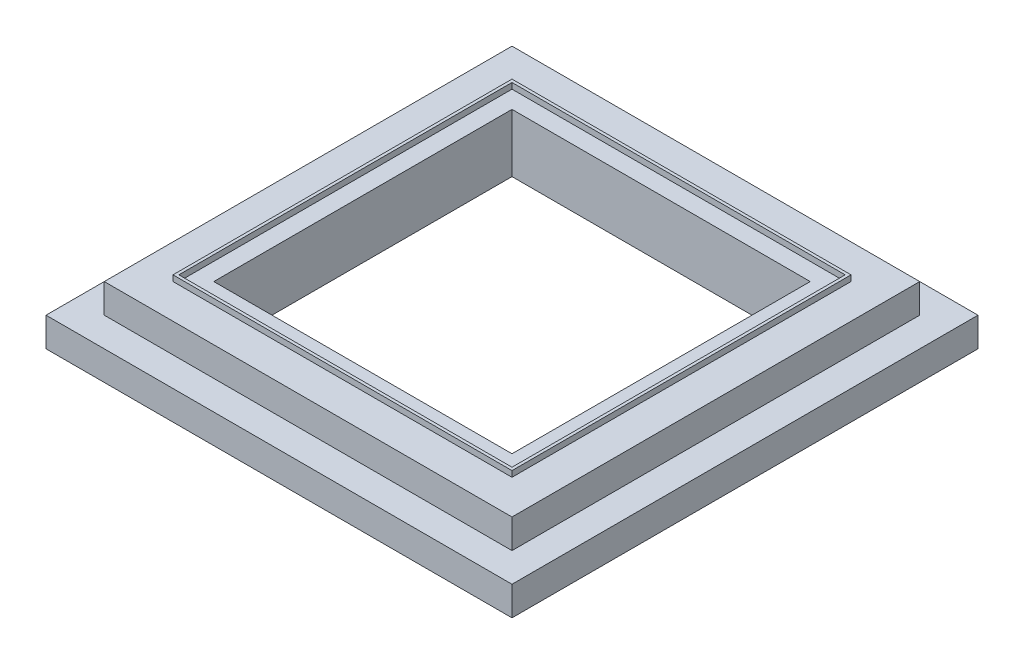
ISO-10303-21;
HEADER;
FILE_DESCRIPTION(('STEP AP214'),'2;1');
FILE_NAME('part.step','',(''),(''),'','','');
FILE_SCHEMA(('AUTOMOTIVE_DESIGN { 1 0 10303 214 1 1 1 1 }'));
ENDSEC;
DATA;
#1=APPLICATION_CONTEXT('core data for automotive mechanical design processes');
#2=APPLICATION_PROTOCOL_DEFINITION('international standard','automotive_design',2000,#1);
#3=PRODUCT_CONTEXT('',#1,'mechanical');
#4=PRODUCT('Part','Part','',(#3));
#5=PRODUCT_RELATED_PRODUCT_CATEGORY('part','',(#4));
#6=PRODUCT_DEFINITION_FORMATION('','',#4);
#7=PRODUCT_DEFINITION_CONTEXT('part definition',#1,'design');
#8=PRODUCT_DEFINITION('design','',#6,#7);
#9=PRODUCT_DEFINITION_SHAPE('','',#8);
#10=(LENGTH_UNIT() NAMED_UNIT(*) SI_UNIT(.MILLI.,.METRE.));
#11=(NAMED_UNIT(*) PLANE_ANGLE_UNIT() SI_UNIT($,.RADIAN.));
#12=(NAMED_UNIT(*) SI_UNIT($,.STERADIAN.) SOLID_ANGLE_UNIT());
#13=UNCERTAINTY_MEASURE_WITH_UNIT(LENGTH_MEASURE(1.E-05),#10,'distance_accuracy_value','');
#14=(GEOMETRIC_REPRESENTATION_CONTEXT(3) GLOBAL_UNCERTAINTY_ASSIGNED_CONTEXT((#13)) GLOBAL_UNIT_ASSIGNED_CONTEXT((#10,
#11,#12)) REPRESENTATION_CONTEXT('',''));
#15=CARTESIAN_POINT('',(0.,0.,0.));
#16=DIRECTION('',(0.,0.,1.));
#17=DIRECTION('',(1.,0.,0.));
#18=AXIS2_PLACEMENT_3D('',#15,#16,#17);
#19=CARTESIAN_POINT('',(0.,10.,0.));
#20=DIRECTION('',(0.,-1.,0.));
#21=DIRECTION('',(0.,0.,-1.));
#22=AXIS2_PLACEMENT_3D('',#19,#20,#21);
#23=PLANE('',#22);
#24=DIRECTION('',(0.,0.,1.));
#25=VECTOR('',#24,1.);
#26=CARTESIAN_POINT('',(-35.,10.,35.));
#27=LINE('',#26,#25);
#28=CARTESIAN_POINT('',(-35.,10.,-35.));
#29=VERTEX_POINT('',#28);
#30=CARTESIAN_POINT('',(-35.,10.,35.));
#31=VERTEX_POINT('',#30);
#32=EDGE_CURVE('E300',#29,#31,#27,.T.);
#33=ORIENTED_EDGE('',*,*,#32,.T.);
#34=DIRECTION('',(1.,0.,0.));
#35=VECTOR('',#34,1.);
#36=CARTESIAN_POINT('',(-35.,10.,35.));
#37=LINE('',#36,#35);
#38=CARTESIAN_POINT('',(35.,10.,35.));
#39=VERTEX_POINT('',#38);
#40=EDGE_CURVE('E315',#31,#39,#37,.T.);
#41=ORIENTED_EDGE('',*,*,#40,.T.);
#42=DIRECTION('',(0.,0.,-1.));
#43=VECTOR('',#42,1.);
#44=CARTESIAN_POINT('',(35.,10.,35.));
#45=LINE('',#44,#43);
#46=CARTESIAN_POINT('',(35.,10.,-35.));
#47=VERTEX_POINT('',#46);
#48=EDGE_CURVE('E363',#39,#47,#45,.T.);
#49=ORIENTED_EDGE('',*,*,#48,.T.);
#50=DIRECTION('',(-1.,0.,0.));
#51=VECTOR('',#50,1.);
#52=CARTESIAN_POINT('',(-35.,10.,-35.));
#53=LINE('',#52,#51);
#54=EDGE_CURVE('E402',#47,#29,#53,.T.);
#55=ORIENTED_EDGE('',*,*,#54,.T.);
#56=EDGE_LOOP('',(#33,#41,#49,#55));
#57=FACE_BOUND('',#56,.T.);
#58=DIRECTION('',(0.,0.,-1.));
#59=VECTOR('',#58,1.);
#60=CARTESIAN_POINT('',(29.1,10.,0.));
#61=LINE('',#60,#59);
#62=CARTESIAN_POINT('',(29.1,10.,29.1));
#63=VERTEX_POINT('',#62);
#64=CARTESIAN_POINT('',(29.1,10.,-29.1));
#65=VERTEX_POINT('',#64);
#66=EDGE_CURVE('E238',#63,#65,#61,.T.);
#67=ORIENTED_EDGE('',*,*,#66,.F.);
#68=DIRECTION('',(1.,0.,0.));
#69=VECTOR('',#68,1.);
#70=CARTESIAN_POINT('',(0.,10.,29.1));
#71=LINE('',#70,#69);
#72=CARTESIAN_POINT('',(-29.1,10.,29.1));
#73=VERTEX_POINT('',#72);
#74=EDGE_CURVE('E213',#73,#63,#71,.T.);
#75=ORIENTED_EDGE('',*,*,#74,.F.);
#76=DIRECTION('',(0.,0.,1.));
#77=VECTOR('',#76,1.);
#78=CARTESIAN_POINT('',(-29.1,10.,0.));
#79=LINE('',#78,#77);
#80=CARTESIAN_POINT('',(-29.1,10.,-29.1));
#81=VERTEX_POINT('',#80);
#82=EDGE_CURVE('E242',#81,#73,#79,.T.);
#83=ORIENTED_EDGE('',*,*,#82,.F.);
#84=DIRECTION('',(-1.,0.,0.));
#85=VECTOR('',#84,1.);
#86=CARTESIAN_POINT('',(0.,10.,-29.1));
#87=LINE('',#86,#85);
#88=EDGE_CURVE('E77',#65,#81,#87,.T.);
#89=ORIENTED_EDGE('',*,*,#88,.F.);
#90=EDGE_LOOP('',(#67,#75,#83,#89));
#91=FACE_BOUND('',#90,.T.);
#92=ADVANCED_FACE('F51',(#57,#91),#23,.F.);
#93=CARTESIAN_POINT('',(0.,5.,0.));
#94=DIRECTION('',(0.,1.,0.));
#95=DIRECTION('',(0.,0.,1.));
#96=AXIS2_PLACEMENT_3D('',#93,#94,#95);
#97=PLANE('',#96);
#98=DIRECTION('',(-1.,0.,0.));
#99=VECTOR('',#98,1.);
#100=CARTESIAN_POINT('',(40.,5.,-40.));
#101=LINE('',#100,#99);
#102=CARTESIAN_POINT('',(40.,5.,-40.));
#103=VERTEX_POINT('',#102);
#104=CARTESIAN_POINT('',(-40.,5.,-40.));
#105=VERTEX_POINT('',#104);
#106=EDGE_CURVE('E520',#103,#105,#101,.T.);
#107=ORIENTED_EDGE('',*,*,#106,.T.);
#108=DIRECTION('',(0.,0.,1.));
#109=VECTOR('',#108,1.);
#110=CARTESIAN_POINT('',(-40.,5.,-40.));
#111=LINE('',#110,#109);
#112=CARTESIAN_POINT('',(-40.,5.,40.));
#113=VERTEX_POINT('',#112);
#114=EDGE_CURVE('E514',#105,#113,#111,.T.);
#115=ORIENTED_EDGE('',*,*,#114,.T.);
#116=DIRECTION('',(1.,0.,0.));
#117=VECTOR('',#116,1.);
#118=CARTESIAN_POINT('',(-40.,5.,40.));
#119=LINE('',#118,#117);
#120=CARTESIAN_POINT('',(40.,5.,40.));
#121=VERTEX_POINT('',#120);
#122=EDGE_CURVE('E61',#113,#121,#119,.T.);
#123=ORIENTED_EDGE('',*,*,#122,.T.);
#124=DIRECTION('',(0.,0.,-1.));
#125=VECTOR('',#124,1.);
#126=CARTESIAN_POINT('',(40.,5.,40.));
#127=LINE('',#126,#125);
#128=EDGE_CURVE('E12',#121,#103,#127,.T.);
#129=ORIENTED_EDGE('',*,*,#128,.T.);
#130=EDGE_LOOP('',(#107,#115,#123,#129));
#131=FACE_BOUND('',#130,.T.);
#132=DIRECTION('',(0.,0.,-1.));
#133=VECTOR('',#132,1.);
#134=CARTESIAN_POINT('',(35.,5.,35.));
#135=LINE('',#134,#133);
#136=CARTESIAN_POINT('',(35.,5.,35.));
#137=VERTEX_POINT('',#136);
#138=CARTESIAN_POINT('',(35.,5.,-35.));
#139=VERTEX_POINT('',#138);
#140=EDGE_CURVE('E529',#137,#139,#135,.T.);
#141=ORIENTED_EDGE('',*,*,#140,.F.);
#142=DIRECTION('',(1.,0.,0.));
#143=VECTOR('',#142,1.);
#144=CARTESIAN_POINT('',(-35.,5.,35.));
#145=LINE('',#144,#143);
#146=CARTESIAN_POINT('',(-35.,5.,35.));
#147=VERTEX_POINT('',#146);
#148=EDGE_CURVE('E290',#147,#137,#145,.T.);
#149=ORIENTED_EDGE('',*,*,#148,.F.);
#150=DIRECTION('',(0.,0.,-1.));
#151=VECTOR('',#150,1.);
#152=CARTESIAN_POINT('',(-35.,5.,35.));
#153=LINE('',#152,#151);
#154=CARTESIAN_POINT('',(-35.,5.,-35.));
#155=VERTEX_POINT('',#154);
#156=EDGE_CURVE('E305',#147,#155,#153,.T.);
#157=ORIENTED_EDGE('',*,*,#156,.T.);
#158=DIRECTION('',(1.,0.,0.));
#159=VECTOR('',#158,1.);
#160=CARTESIAN_POINT('',(-35.,5.,-35.));
#161=LINE('',#160,#159);
#162=EDGE_CURVE('E536',#155,#139,#161,.T.);
#163=ORIENTED_EDGE('',*,*,#162,.T.);
#164=EDGE_LOOP('',(#141,#149,#157,#163));
#165=FACE_BOUND('',#164,.T.);
#166=ADVANCED_FACE('F53',(#131,#165),#97,.T.);
#167=CARTESIAN_POINT('',(0.,0.,0.));
#168=DIRECTION('',(0.,-1.,0.));
#169=DIRECTION('',(0.,0.,-1.));
#170=AXIS2_PLACEMENT_3D('',#167,#168,#169);
#171=PLANE('',#170);
#172=DIRECTION('',(0.,0.,1.));
#173=VECTOR('',#172,1.);
#174=CARTESIAN_POINT('',(25.6,0.,0.));
#175=LINE('',#174,#173);
#176=CARTESIAN_POINT('',(25.6,0.,-25.6));
#177=VERTEX_POINT('',#176);
#178=CARTESIAN_POINT('',(25.6,0.,25.6));
#179=VERTEX_POINT('',#178);
#180=EDGE_CURVE('E288',#177,#179,#175,.T.);
#181=ORIENTED_EDGE('',*,*,#180,.F.);
#182=DIRECTION('',(1.,0.,0.));
#183=VECTOR('',#182,1.);
#184=CARTESIAN_POINT('',(0.,0.,-25.6));
#185=LINE('',#184,#183);
#186=CARTESIAN_POINT('',(-25.6,0.,-25.6));
#187=VERTEX_POINT('',#186);
#188=EDGE_CURVE('E275',#187,#177,#185,.T.);
#189=ORIENTED_EDGE('',*,*,#188,.F.);
#190=DIRECTION('',(0.,0.,-1.));
#191=VECTOR('',#190,1.);
#192=CARTESIAN_POINT('',(-25.6,0.,0.));
#193=LINE('',#192,#191);
#194=CARTESIAN_POINT('',(-25.6,0.,25.6));
#195=VERTEX_POINT('',#194);
#196=EDGE_CURVE('E283',#195,#187,#193,.T.);
#197=ORIENTED_EDGE('',*,*,#196,.F.);
#198=DIRECTION('',(-1.,0.,0.));
#199=VECTOR('',#198,1.);
#200=CARTESIAN_POINT('',(0.,0.,25.6));
#201=LINE('',#200,#199);
#202=EDGE_CURVE('E286',#179,#195,#201,.T.);
#203=ORIENTED_EDGE('',*,*,#202,.F.);
#204=EDGE_LOOP('',(#181,#189,#197,#203));
#205=FACE_BOUND('',#204,.T.);
#206=DIRECTION('',(0.,0.,-1.));
#207=VECTOR('',#206,1.);
#208=CARTESIAN_POINT('',(40.,0.,40.));
#209=LINE('',#208,#207);
#210=CARTESIAN_POINT('',(40.,0.,40.));
#211=VERTEX_POINT('',#210);
#212=CARTESIAN_POINT('',(40.,0.,-40.));
#213=VERTEX_POINT('',#212);
#214=EDGE_CURVE('E362',#211,#213,#209,.T.);
#215=ORIENTED_EDGE('',*,*,#214,.F.);
#216=DIRECTION('',(1.,0.,0.));
#217=VECTOR('',#216,1.);
#218=CARTESIAN_POINT('',(-40.,0.,40.));
#219=LINE('',#218,#217);
#220=CARTESIAN_POINT('',(-40.,0.,40.));
#221=VERTEX_POINT('',#220);
#222=EDGE_CURVE('E421',#221,#211,#219,.T.);
#223=ORIENTED_EDGE('',*,*,#222,.F.);
#224=DIRECTION('',(0.,0.,1.));
#225=VECTOR('',#224,1.);
#226=CARTESIAN_POINT('',(-40.,0.,40.));
#227=LINE('',#226,#225);
#228=CARTESIAN_POINT('',(-40.,0.,-40.));
#229=VERTEX_POINT('',#228);
#230=EDGE_CURVE('E459',#229,#221,#227,.T.);
#231=ORIENTED_EDGE('',*,*,#230,.F.);
#232=DIRECTION('',(-1.,0.,0.));
#233=VECTOR('',#232,1.);
#234=CARTESIAN_POINT('',(-40.,0.,-40.));
#235=LINE('',#234,#233);
#236=EDGE_CURVE('E478',#213,#229,#235,.T.);
#237=ORIENTED_EDGE('',*,*,#236,.F.);
#238=EDGE_LOOP('',(#215,#223,#231,#237));
#239=FACE_BOUND('',#238,.T.);
#240=ADVANCED_FACE('F387',(#205,#239),#171,.T.);
#241=CARTESIAN_POINT('',(-40.,0.,0.));
#242=DIRECTION('',(1.,0.,0.));
#243=DIRECTION('',(0.,0.,-1.));
#244=AXIS2_PLACEMENT_3D('',#241,#242,#243);
#245=PLANE('',#244);
#246=DIRECTION('',(0.,1.,0.));
#247=VECTOR('',#246,1.);
#248=CARTESIAN_POINT('',(-40.,0.,40.));
#249=LINE('',#248,#247);
#250=EDGE_CURVE('E427',#221,#113,#249,.T.);
#251=ORIENTED_EDGE('',*,*,#250,.T.);
#252=ORIENTED_EDGE('',*,*,#114,.F.);
#253=DIRECTION('',(0.,1.,0.));
#254=VECTOR('',#253,1.);
#255=CARTESIAN_POINT('',(-40.,0.,-40.));
#256=LINE('',#255,#254);
#257=EDGE_CURVE('E799',#229,#105,#256,.T.);
#258=ORIENTED_EDGE('',*,*,#257,.F.);
#259=ORIENTED_EDGE('',*,*,#230,.T.);
#260=EDGE_LOOP('',(#251,#252,#258,#259));
#261=FACE_BOUND('',#260,.T.);
#262=ADVANCED_FACE('F634',(#261),#245,.F.);
#263=CARTESIAN_POINT('',(0.,0.,-40.));
#264=DIRECTION('',(0.,0.,1.));
#265=DIRECTION('',(1.,0.,0.));
#266=AXIS2_PLACEMENT_3D('',#263,#264,#265);
#267=PLANE('',#266);
#268=ORIENTED_EDGE('',*,*,#257,.T.);
#269=ORIENTED_EDGE('',*,*,#106,.F.);
#270=DIRECTION('',(0.,1.,0.));
#271=VECTOR('',#270,1.);
#272=CARTESIAN_POINT('',(40.,0.,-40.));
#273=LINE('',#272,#271);
#274=EDGE_CURVE('E794',#213,#103,#273,.T.);
#275=ORIENTED_EDGE('',*,*,#274,.F.);
#276=ORIENTED_EDGE('',*,*,#236,.T.);
#277=EDGE_LOOP('',(#268,#269,#275,#276));
#278=FACE_BOUND('',#277,.T.);
#279=ADVANCED_FACE('F438',(#278),#267,.F.);
#280=CARTESIAN_POINT('',(0.,0.,40.));
#281=DIRECTION('',(0.,0.,-1.));
#282=DIRECTION('',(-1.,0.,0.));
#283=AXIS2_PLACEMENT_3D('',#280,#281,#282);
#284=PLANE('',#283);
#285=DIRECTION('',(0.,1.,0.));
#286=VECTOR('',#285,1.);
#287=CARTESIAN_POINT('',(40.,0.,40.));
#288=LINE('',#287,#286);
#289=EDGE_CURVE('E797',#211,#121,#288,.T.);
#290=ORIENTED_EDGE('',*,*,#289,.T.);
#291=ORIENTED_EDGE('',*,*,#122,.F.);
#292=ORIENTED_EDGE('',*,*,#250,.F.);
#293=ORIENTED_EDGE('',*,*,#222,.T.);
#294=EDGE_LOOP('',(#290,#291,#292,#293));
#295=FACE_BOUND('',#294,.T.);
#296=ADVANCED_FACE('F429',(#295),#284,.F.);
#297=CARTESIAN_POINT('',(40.,0.,0.));
#298=DIRECTION('',(-1.,0.,0.));
#299=DIRECTION('',(0.,0.,1.));
#300=AXIS2_PLACEMENT_3D('',#297,#298,#299);
#301=PLANE('',#300);
#302=ORIENTED_EDGE('',*,*,#274,.T.);
#303=ORIENTED_EDGE('',*,*,#128,.F.);
#304=ORIENTED_EDGE('',*,*,#289,.F.);
#305=ORIENTED_EDGE('',*,*,#214,.T.);
#306=EDGE_LOOP('',(#302,#303,#304,#305));
#307=FACE_BOUND('',#306,.T.);
#308=ADVANCED_FACE('F383',(#307),#301,.F.);
#309=DIRECTION('',(-1.,0.,0.));
#310=VECTOR('',#309,1.);
#311=CARTESIAN_POINT('',(0.,10.,-28.6));
#312=LINE('',#311,#310);
#313=CARTESIAN_POINT('',(28.6,10.,-28.6));
#314=VERTEX_POINT('',#313);
#315=CARTESIAN_POINT('',(-28.6,10.,-28.6));
#316=VERTEX_POINT('',#315);
#317=EDGE_CURVE('E232',#314,#316,#312,.T.);
#318=ORIENTED_EDGE('',*,*,#317,.T.);
#319=DIRECTION('',(0.,0.,1.));
#320=VECTOR('',#319,1.);
#321=CARTESIAN_POINT('',(-28.6,10.,0.));
#322=LINE('',#321,#320);
#323=CARTESIAN_POINT('',(-28.6,10.,28.6));
#324=VERTEX_POINT('',#323);
#325=EDGE_CURVE('E196',#316,#324,#322,.T.);
#326=ORIENTED_EDGE('',*,*,#325,.T.);
#327=DIRECTION('',(1.,0.,0.));
#328=VECTOR('',#327,1.);
#329=CARTESIAN_POINT('',(0.,10.,28.6));
#330=LINE('',#329,#328);
#331=CARTESIAN_POINT('',(28.6,10.,28.6));
#332=VERTEX_POINT('',#331);
#333=EDGE_CURVE('E235',#324,#332,#330,.T.);
#334=ORIENTED_EDGE('',*,*,#333,.T.);
#335=DIRECTION('',(0.,0.,-1.));
#336=VECTOR('',#335,1.);
#337=CARTESIAN_POINT('',(28.6,10.,0.));
#338=LINE('',#337,#336);
#339=EDGE_CURVE('E69',#332,#314,#338,.T.);
#340=ORIENTED_EDGE('',*,*,#339,.T.);
#341=EDGE_LOOP('',(#318,#326,#334,#340));
#342=FACE_BOUND('',#341,.T.);
#343=DIRECTION('',(-1.,0.,0.));
#344=VECTOR('',#343,1.);
#345=CARTESIAN_POINT('',(-25.6,10.,-25.6));
#346=LINE('',#345,#344);
#347=CARTESIAN_POINT('',(25.6,10.,-25.6));
#348=VERTEX_POINT('',#347);
#349=CARTESIAN_POINT('',(-25.6,10.,-25.6));
#350=VERTEX_POINT('',#349);
#351=EDGE_CURVE('E263',#348,#350,#346,.T.);
#352=ORIENTED_EDGE('',*,*,#351,.F.);
#353=DIRECTION('',(0.,0.,-1.));
#354=VECTOR('',#353,1.);
#355=CARTESIAN_POINT('',(25.6,10.,25.6));
#356=LINE('',#355,#354);
#357=CARTESIAN_POINT('',(25.6,10.,25.6));
#358=VERTEX_POINT('',#357);
#359=EDGE_CURVE('E257',#358,#348,#356,.T.);
#360=ORIENTED_EDGE('',*,*,#359,.F.);
#361=DIRECTION('',(1.,0.,0.));
#362=VECTOR('',#361,1.);
#363=CARTESIAN_POINT('',(-25.6,10.,25.6));
#364=LINE('',#363,#362);
#365=CARTESIAN_POINT('',(-25.6,10.,25.6));
#366=VERTEX_POINT('',#365);
#367=EDGE_CURVE('E269',#366,#358,#364,.T.);
#368=ORIENTED_EDGE('',*,*,#367,.F.);
#369=DIRECTION('',(0.,0.,1.));
#370=VECTOR('',#369,1.);
#371=CARTESIAN_POINT('',(-25.6,10.,25.6));
#372=LINE('',#371,#370);
#373=EDGE_CURVE('E266',#350,#366,#372,.T.);
#374=ORIENTED_EDGE('',*,*,#373,.F.);
#375=EDGE_LOOP('',(#352,#360,#368,#374));
#376=FACE_BOUND('',#375,.T.);
#377=ADVANCED_FACE('F334',(#342,#376),#23,.F.);
#378=CARTESIAN_POINT('',(0.,0.,35.));
#379=DIRECTION('',(0.,0.,-1.));
#380=DIRECTION('',(-1.,0.,0.));
#381=AXIS2_PLACEMENT_3D('',#378,#379,#380);
#382=PLANE('',#381);
#383=DIRECTION('',(0.,1.,0.));
#384=VECTOR('',#383,1.);
#385=CARTESIAN_POINT('',(35.,5.,35.));
#386=LINE('',#385,#384);
#387=EDGE_CURVE('E294',#137,#39,#386,.T.);
#388=ORIENTED_EDGE('',*,*,#387,.T.);
#389=ORIENTED_EDGE('',*,*,#40,.F.);
#390=DIRECTION('',(0.,1.,0.));
#391=VECTOR('',#390,1.);
#392=CARTESIAN_POINT('',(-35.,5.,35.));
#393=LINE('',#392,#391);
#394=EDGE_CURVE('E291',#147,#31,#393,.T.);
#395=ORIENTED_EDGE('',*,*,#394,.F.);
#396=ORIENTED_EDGE('',*,*,#148,.T.);
#397=EDGE_LOOP('',(#388,#389,#395,#396));
#398=FACE_BOUND('',#397,.T.);
#399=ADVANCED_FACE('F323',(#398),#382,.F.);
#400=CARTESIAN_POINT('',(-35.,0.,0.));
#401=DIRECTION('',(1.,0.,0.));
#402=DIRECTION('',(0.,0.,-1.));
#403=AXIS2_PLACEMENT_3D('',#400,#401,#402);
#404=PLANE('',#403);
#405=ORIENTED_EDGE('',*,*,#394,.T.);
#406=ORIENTED_EDGE('',*,*,#32,.F.);
#407=DIRECTION('',(0.,1.,0.));
#408=VECTOR('',#407,1.);
#409=CARTESIAN_POINT('',(-35.,5.,-35.));
#410=LINE('',#409,#408);
#411=EDGE_CURVE('E297',#155,#29,#410,.T.);
#412=ORIENTED_EDGE('',*,*,#411,.F.);
#413=ORIENTED_EDGE('',*,*,#156,.F.);
#414=EDGE_LOOP('',(#405,#406,#412,#413));
#415=FACE_BOUND('',#414,.T.);
#416=ADVANCED_FACE('F333',(#415),#404,.F.);
#417=CARTESIAN_POINT('',(35.,0.,0.));
#418=DIRECTION('',(-1.,0.,0.));
#419=DIRECTION('',(0.,0.,1.));
#420=AXIS2_PLACEMENT_3D('',#417,#418,#419);
#421=PLANE('',#420);
#422=DIRECTION('',(0.,1.,0.));
#423=VECTOR('',#422,1.);
#424=CARTESIAN_POINT('',(35.,5.,-35.));
#425=LINE('',#424,#423);
#426=EDGE_CURVE('E293',#139,#47,#425,.T.);
#427=ORIENTED_EDGE('',*,*,#426,.T.);
#428=ORIENTED_EDGE('',*,*,#48,.F.);
#429=ORIENTED_EDGE('',*,*,#387,.F.);
#430=ORIENTED_EDGE('',*,*,#140,.T.);
#431=EDGE_LOOP('',(#427,#428,#429,#430));
#432=FACE_BOUND('',#431,.T.);
#433=ADVANCED_FACE('F340',(#432),#421,.F.);
#434=CARTESIAN_POINT('',(0.,0.,-35.));
#435=DIRECTION('',(0.,0.,1.));
#436=DIRECTION('',(1.,0.,0.));
#437=AXIS2_PLACEMENT_3D('',#434,#435,#436);
#438=PLANE('',#437);
#439=ORIENTED_EDGE('',*,*,#411,.T.);
#440=ORIENTED_EDGE('',*,*,#54,.F.);
#441=ORIENTED_EDGE('',*,*,#426,.F.);
#442=ORIENTED_EDGE('',*,*,#162,.F.);
#443=EDGE_LOOP('',(#439,#440,#441,#442));
#444=FACE_BOUND('',#443,.T.);
#445=ADVANCED_FACE('F385',(#444),#438,.F.);
#446=CARTESIAN_POINT('',(25.6,-9.99999999994061E-05,25.6));
#447=DIRECTION('',(1.,0.,0.));
#448=DIRECTION('',(0.,0.,-1.));
#449=AXIS2_PLACEMENT_3D('',#446,#447,#448);
#450=PLANE('',#449);
#451=ORIENTED_EDGE('',*,*,#180,.T.);
#452=DIRECTION('',(0.,1.,0.));
#453=VECTOR('',#452,1.);
#454=CARTESIAN_POINT('',(25.6,-9.99999999994061E-05,25.6));
#455=LINE('',#454,#453);
#456=EDGE_CURVE('E273',#179,#358,#455,.T.);
#457=ORIENTED_EDGE('',*,*,#456,.T.);
#458=ORIENTED_EDGE('',*,*,#359,.T.);
#459=DIRECTION('',(0.,1.,0.));
#460=VECTOR('',#459,1.);
#461=CARTESIAN_POINT('',(25.6,-9.99999999994061E-05,-25.6));
#462=LINE('',#461,#460);
#463=EDGE_CURVE('E272',#177,#348,#462,.T.);
#464=ORIENTED_EDGE('',*,*,#463,.F.);
#465=EDGE_LOOP('',(#451,#457,#458,#464));
#466=FACE_BOUND('',#465,.T.);
#467=ADVANCED_FACE('F335',(#466),#450,.F.);
#468=CARTESIAN_POINT('',(-25.6,-9.99999999994061E-05,25.6));
#469=DIRECTION('',(0.,0.,1.));
#470=DIRECTION('',(1.,0.,0.));
#471=AXIS2_PLACEMENT_3D('',#468,#469,#470);
#472=PLANE('',#471);
#473=ORIENTED_EDGE('',*,*,#202,.T.);
#474=DIRECTION('',(0.,1.,0.));
#475=VECTOR('',#474,1.);
#476=CARTESIAN_POINT('',(-25.6,-9.99999999994061E-05,25.6));
#477=LINE('',#476,#475);
#478=EDGE_CURVE('E276',#195,#366,#477,.T.);
#479=ORIENTED_EDGE('',*,*,#478,.T.);
#480=ORIENTED_EDGE('',*,*,#367,.T.);
#481=ORIENTED_EDGE('',*,*,#456,.F.);
#482=EDGE_LOOP('',(#473,#479,#480,#481));
#483=FACE_BOUND('',#482,.T.);
#484=ADVANCED_FACE('F608',(#483),#472,.F.);
#485=CARTESIAN_POINT('',(-25.6,-9.99999999994061E-05,25.6));
#486=DIRECTION('',(-1.,0.,0.));
#487=DIRECTION('',(0.,0.,1.));
#488=AXIS2_PLACEMENT_3D('',#485,#486,#487);
#489=PLANE('',#488);
#490=ORIENTED_EDGE('',*,*,#196,.T.);
#491=DIRECTION('',(0.,1.,0.));
#492=VECTOR('',#491,1.);
#493=CARTESIAN_POINT('',(-25.6,-9.99999999994061E-05,-25.6));
#494=LINE('',#493,#492);
#495=EDGE_CURVE('E278',#187,#350,#494,.T.);
#496=ORIENTED_EDGE('',*,*,#495,.T.);
#497=ORIENTED_EDGE('',*,*,#373,.T.);
#498=ORIENTED_EDGE('',*,*,#478,.F.);
#499=EDGE_LOOP('',(#490,#496,#497,#498));
#500=FACE_BOUND('',#499,.T.);
#501=ADVANCED_FACE('F611',(#500),#489,.F.);
#502=CARTESIAN_POINT('',(-25.6,-9.99999999994061E-05,-25.6));
#503=DIRECTION('',(0.,0.,-1.));
#504=DIRECTION('',(-1.,0.,0.));
#505=AXIS2_PLACEMENT_3D('',#502,#503,#504);
#506=PLANE('',#505);
#507=ORIENTED_EDGE('',*,*,#188,.T.);
#508=ORIENTED_EDGE('',*,*,#463,.T.);
#509=ORIENTED_EDGE('',*,*,#351,.T.);
#510=ORIENTED_EDGE('',*,*,#495,.F.);
#511=EDGE_LOOP('',(#507,#508,#509,#510));
#512=FACE_BOUND('',#511,.T.);
#513=ADVANCED_FACE('F593',(#512),#506,.F.);
#514=CARTESIAN_POINT('',(29.1,11.,0.));
#515=DIRECTION('',(-1.,0.,0.));
#516=DIRECTION('',(0.,0.,1.));
#517=AXIS2_PLACEMENT_3D('',#514,#515,#516);
#518=PLANE('',#517);
#519=ORIENTED_EDGE('',*,*,#66,.T.);
#520=DIRECTION('',(0.,-1.,0.));
#521=VECTOR('',#520,1.);
#522=CARTESIAN_POINT('',(29.1,11.,-29.1));
#523=LINE('',#522,#521);
#524=CARTESIAN_POINT('',(29.1,11.,-29.1));
#525=VERTEX_POINT('',#524);
#526=EDGE_CURVE('E255',#525,#65,#523,.T.);
#527=ORIENTED_EDGE('',*,*,#526,.F.);
#528=DIRECTION('',(0.,0.,-1.));
#529=VECTOR('',#528,1.);
#530=CARTESIAN_POINT('',(29.1,11.,0.));
#531=LINE('',#530,#529);
#532=CARTESIAN_POINT('',(29.1,11.,29.1));
#533=VERTEX_POINT('',#532);
#534=EDGE_CURVE('E221',#533,#525,#531,.T.);
#535=ORIENTED_EDGE('',*,*,#534,.F.);
#536=DIRECTION('',(0.,-1.,0.));
#537=VECTOR('',#536,1.);
#538=CARTESIAN_POINT('',(29.1,11.,29.1));
#539=LINE('',#538,#537);
#540=EDGE_CURVE('E201',#533,#63,#539,.T.);
#541=ORIENTED_EDGE('',*,*,#540,.T.);
#542=EDGE_LOOP('',(#519,#527,#535,#541));
#543=FACE_BOUND('',#542,.T.);
#544=ADVANCED_FACE('F579',(#543),#518,.F.);
#545=CARTESIAN_POINT('',(0.,11.,-29.1));
#546=DIRECTION('',(0.,0.,1.));
#547=DIRECTION('',(1.,0.,0.));
#548=AXIS2_PLACEMENT_3D('',#545,#546,#547);
#549=PLANE('',#548);
#550=ORIENTED_EDGE('',*,*,#88,.T.);
#551=DIRECTION('',(0.,-1.,0.));
#552=VECTOR('',#551,1.);
#553=CARTESIAN_POINT('',(-29.1,11.,-29.1));
#554=LINE('',#553,#552);
#555=CARTESIAN_POINT('',(-29.1,11.,-29.1));
#556=VERTEX_POINT('',#555);
#557=EDGE_CURVE('E252',#556,#81,#554,.T.);
#558=ORIENTED_EDGE('',*,*,#557,.F.);
#559=DIRECTION('',(-1.,0.,0.));
#560=VECTOR('',#559,1.);
#561=CARTESIAN_POINT('',(0.,11.,-29.1));
#562=LINE('',#561,#560);
#563=EDGE_CURVE('E224',#525,#556,#562,.T.);
#564=ORIENTED_EDGE('',*,*,#563,.F.);
#565=ORIENTED_EDGE('',*,*,#526,.T.);
#566=EDGE_LOOP('',(#550,#558,#564,#565));
#567=FACE_BOUND('',#566,.T.);
#568=ADVANCED_FACE('F585',(#567),#549,.F.);
#569=CARTESIAN_POINT('',(-29.1,11.,0.));
#570=DIRECTION('',(1.,0.,0.));
#571=DIRECTION('',(0.,0.,-1.));
#572=AXIS2_PLACEMENT_3D('',#569,#570,#571);
#573=PLANE('',#572);
#574=ORIENTED_EDGE('',*,*,#82,.T.);
#575=DIRECTION('',(0.,-1.,0.));
#576=VECTOR('',#575,1.);
#577=CARTESIAN_POINT('',(-29.1,11.,29.1));
#578=LINE('',#577,#576);
#579=CARTESIAN_POINT('',(-29.1,11.,29.1));
#580=VERTEX_POINT('',#579);
#581=EDGE_CURVE('E249',#580,#73,#578,.T.);
#582=ORIENTED_EDGE('',*,*,#581,.F.);
#583=DIRECTION('',(0.,0.,1.));
#584=VECTOR('',#583,1.);
#585=CARTESIAN_POINT('',(-29.1,11.,0.));
#586=LINE('',#585,#584);
#587=EDGE_CURVE('E226',#556,#580,#586,.T.);
#588=ORIENTED_EDGE('',*,*,#587,.F.);
#589=ORIENTED_EDGE('',*,*,#557,.T.);
#590=EDGE_LOOP('',(#574,#582,#588,#589));
#591=FACE_BOUND('',#590,.T.);
#592=ADVANCED_FACE('F583',(#591),#573,.F.);
#593=CARTESIAN_POINT('',(-28.6,11.,0.));
#594=DIRECTION('',(1.,0.,0.));
#595=DIRECTION('',(0.,0.,-1.));
#596=AXIS2_PLACEMENT_3D('',#593,#594,#595);
#597=PLANE('',#596);
#598=ORIENTED_EDGE('',*,*,#325,.F.);
#599=DIRECTION('',(0.,-1.,0.));
#600=VECTOR('',#599,1.);
#601=CARTESIAN_POINT('',(-28.6,11.,-28.6));
#602=LINE('',#601,#600);
#603=CARTESIAN_POINT('',(-28.6,11.,-28.6));
#604=VERTEX_POINT('',#603);
#605=EDGE_CURVE('E190',#604,#316,#602,.T.);
#606=ORIENTED_EDGE('',*,*,#605,.F.);
#607=DIRECTION('',(0.,0.,1.));
#608=VECTOR('',#607,1.);
#609=CARTESIAN_POINT('',(-28.6,11.,0.));
#610=LINE('',#609,#608);
#611=CARTESIAN_POINT('',(-28.6,11.,28.6));
#612=VERTEX_POINT('',#611);
#613=EDGE_CURVE('E193',#604,#612,#610,.T.);
#614=ORIENTED_EDGE('',*,*,#613,.T.);
#615=DIRECTION('',(0.,-1.,0.));
#616=VECTOR('',#615,1.);
#617=CARTESIAN_POINT('',(-28.6,11.,28.6));
#618=LINE('',#617,#616);
#619=EDGE_CURVE('E230',#612,#324,#618,.T.);
#620=ORIENTED_EDGE('',*,*,#619,.T.);
#621=EDGE_LOOP('',(#598,#606,#614,#620));
#622=FACE_BOUND('',#621,.T.);
#623=ADVANCED_FACE('F192',(#622),#597,.T.);
#624=CARTESIAN_POINT('',(0.,11.,-28.6));
#625=DIRECTION('',(0.,0.,1.));
#626=DIRECTION('',(1.,0.,0.));
#627=AXIS2_PLACEMENT_3D('',#624,#625,#626);
#628=PLANE('',#627);
#629=ORIENTED_EDGE('',*,*,#317,.F.);
#630=DIRECTION('',(0.,-1.,0.));
#631=VECTOR('',#630,1.);
#632=CARTESIAN_POINT('',(28.6,11.,-28.6));
#633=LINE('',#632,#631);
#634=CARTESIAN_POINT('',(28.6,11.,-28.6));
#635=VERTEX_POINT('',#634);
#636=EDGE_CURVE('E202',#635,#314,#633,.T.);
#637=ORIENTED_EDGE('',*,*,#636,.F.);
#638=DIRECTION('',(-1.,0.,0.));
#639=VECTOR('',#638,1.);
#640=CARTESIAN_POINT('',(0.,11.,-28.6));
#641=LINE('',#640,#639);
#642=EDGE_CURVE('E209',#635,#604,#641,.T.);
#643=ORIENTED_EDGE('',*,*,#642,.T.);
#644=ORIENTED_EDGE('',*,*,#605,.T.);
#645=EDGE_LOOP('',(#629,#637,#643,#644));
#646=FACE_BOUND('',#645,.T.);
#647=ADVANCED_FACE('F215',(#646),#628,.T.);
#648=CARTESIAN_POINT('',(28.6,11.,0.));
#649=DIRECTION('',(-1.,0.,0.));
#650=DIRECTION('',(0.,0.,1.));
#651=AXIS2_PLACEMENT_3D('',#648,#649,#650);
#652=PLANE('',#651);
#653=ORIENTED_EDGE('',*,*,#339,.F.);
#654=DIRECTION('',(0.,-1.,0.));
#655=VECTOR('',#654,1.);
#656=CARTESIAN_POINT('',(28.6,11.,28.6));
#657=LINE('',#656,#655);
#658=CARTESIAN_POINT('',(28.6,11.,28.6));
#659=VERTEX_POINT('',#658);
#660=EDGE_CURVE('E259',#659,#332,#657,.T.);
#661=ORIENTED_EDGE('',*,*,#660,.F.);
#662=DIRECTION('',(0.,0.,-1.));
#663=VECTOR('',#662,1.);
#664=CARTESIAN_POINT('',(28.6,11.,0.));
#665=LINE('',#664,#663);
#666=EDGE_CURVE('E216',#659,#635,#665,.T.);
#667=ORIENTED_EDGE('',*,*,#666,.T.);
#668=ORIENTED_EDGE('',*,*,#636,.T.);
#669=EDGE_LOOP('',(#653,#661,#667,#668));
#670=FACE_BOUND('',#669,.T.);
#671=ADVANCED_FACE('F600',(#670),#652,.T.);
#672=CARTESIAN_POINT('',(0.,11.,28.6));
#673=DIRECTION('',(0.,0.,-1.));
#674=DIRECTION('',(-1.,0.,0.));
#675=AXIS2_PLACEMENT_3D('',#672,#673,#674);
#676=PLANE('',#675);
#677=ORIENTED_EDGE('',*,*,#333,.F.);
#678=ORIENTED_EDGE('',*,*,#619,.F.);
#679=DIRECTION('',(1.,0.,0.));
#680=VECTOR('',#679,1.);
#681=CARTESIAN_POINT('',(0.,11.,28.6));
#682=LINE('',#681,#680);
#683=EDGE_CURVE('E212',#612,#659,#682,.T.);
#684=ORIENTED_EDGE('',*,*,#683,.T.);
#685=ORIENTED_EDGE('',*,*,#660,.T.);
#686=EDGE_LOOP('',(#677,#678,#684,#685));
#687=FACE_BOUND('',#686,.T.);
#688=ADVANCED_FACE('F597',(#687),#676,.T.);
#689=CARTESIAN_POINT('',(0.,11.,29.1));
#690=DIRECTION('',(0.,0.,-1.));
#691=DIRECTION('',(-1.,0.,0.));
#692=AXIS2_PLACEMENT_3D('',#689,#690,#691);
#693=PLANE('',#692);
#694=ORIENTED_EDGE('',*,*,#74,.T.);
#695=ORIENTED_EDGE('',*,*,#540,.F.);
#696=DIRECTION('',(1.,0.,0.));
#697=VECTOR('',#696,1.);
#698=CARTESIAN_POINT('',(0.,11.,29.1));
#699=LINE('',#698,#697);
#700=EDGE_CURVE('E228',#580,#533,#699,.T.);
#701=ORIENTED_EDGE('',*,*,#700,.F.);
#702=ORIENTED_EDGE('',*,*,#581,.T.);
#703=EDGE_LOOP('',(#694,#695,#701,#702));
#704=FACE_BOUND('',#703,.T.);
#705=ADVANCED_FACE('F575',(#704),#693,.F.);
#706=CARTESIAN_POINT('',(0.,11.,0.));
#707=DIRECTION('',(0.,1.,0.));
#708=DIRECTION('',(0.,0.,1.));
#709=AXIS2_PLACEMENT_3D('',#706,#707,#708);
#710=PLANE('',#709);
#711=ORIENTED_EDGE('',*,*,#613,.F.);
#712=ORIENTED_EDGE('',*,*,#642,.F.);
#713=ORIENTED_EDGE('',*,*,#666,.F.);
#714=ORIENTED_EDGE('',*,*,#683,.F.);
#715=EDGE_LOOP('',(#711,#712,#713,#714));
#716=FACE_BOUND('',#715,.T.);
#717=ORIENTED_EDGE('',*,*,#534,.T.);
#718=ORIENTED_EDGE('',*,*,#563,.T.);
#719=ORIENTED_EDGE('',*,*,#587,.T.);
#720=ORIENTED_EDGE('',*,*,#700,.T.);
#721=EDGE_LOOP('',(#717,#718,#719,#720));
#722=FACE_BOUND('',#721,.T.);
#723=ADVANCED_FACE('F206',(#716,#722),#710,.T.);
#724=CLOSED_SHELL('',(#92,#166,#240,#262,#279,#296,#308,#377,#399,#416,#433,#445,#467,#484,#501,
#513,#544,#568,#592,#623,#647,#671,#688,#705,#723));
#725=MANIFOLD_SOLID_BREP('B2',#724);
#726=ADVANCED_BREP_SHAPE_REPRESENTATION('',(#18,#725),#14);
#727=SHAPE_DEFINITION_REPRESENTATION(#9,#726);
ENDSEC;
END-ISO-10303-21;
